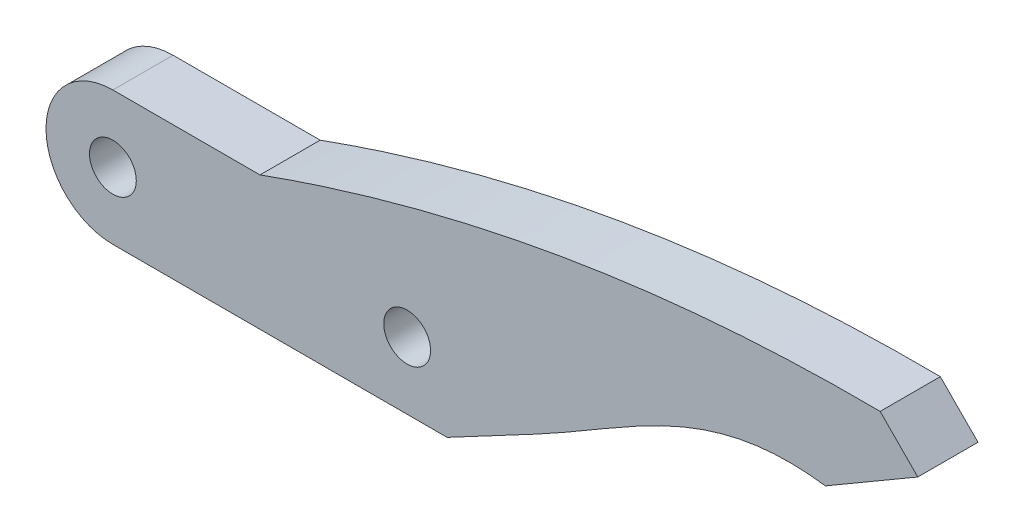
ISO-10303-21;
HEADER;
FILE_DESCRIPTION(('STEP AP214'),'2;1');
FILE_NAME('part.step','',(''),(''),'','','');
FILE_SCHEMA(('AUTOMOTIVE_DESIGN { 1 0 10303 214 1 1 1 1 }'));
ENDSEC;
DATA;
#1=APPLICATION_CONTEXT('core data for automotive mechanical design processes');
#2=APPLICATION_PROTOCOL_DEFINITION('international standard','automotive_design',2000,#1);
#3=PRODUCT_CONTEXT('',#1,'mechanical');
#4=PRODUCT('Part','Part','',(#3));
#5=PRODUCT_RELATED_PRODUCT_CATEGORY('part','',(#4));
#6=PRODUCT_DEFINITION_FORMATION('','',#4);
#7=PRODUCT_DEFINITION_CONTEXT('part definition',#1,'design');
#8=PRODUCT_DEFINITION('design','',#6,#7);
#9=PRODUCT_DEFINITION_SHAPE('','',#8);
#10=(LENGTH_UNIT() NAMED_UNIT(*) SI_UNIT(.MILLI.,.METRE.));
#11=(NAMED_UNIT(*) PLANE_ANGLE_UNIT() SI_UNIT($,.RADIAN.));
#12=(NAMED_UNIT(*) SI_UNIT($,.STERADIAN.) SOLID_ANGLE_UNIT());
#13=UNCERTAINTY_MEASURE_WITH_UNIT(LENGTH_MEASURE(1.E-05),#10,'distance_accuracy_value','');
#14=(GEOMETRIC_REPRESENTATION_CONTEXT(3) GLOBAL_UNCERTAINTY_ASSIGNED_CONTEXT((#13)) GLOBAL_UNIT_ASSIGNED_CONTEXT((#10,
#11,#12)) REPRESENTATION_CONTEXT('',''));
#15=CARTESIAN_POINT('',(0.,0.,0.));
#16=DIRECTION('',(0.,0.,1.));
#17=DIRECTION('',(1.,0.,0.));
#18=AXIS2_PLACEMENT_3D('',#15,#16,#17);
#19=CARTESIAN_POINT('',(-11.,0.,4.5));
#20=DIRECTION('',(0.,0.,-1.));
#21=DIRECTION('',(-1.,0.,0.));
#22=AXIS2_PLACEMENT_3D('',#19,#20,#21);
#23=CYLINDRICAL_SURFACE('',#22,5.);
#24=CARTESIAN_POINT('',(-11.,0.,0.));
#25=DIRECTION('',(0.,0.,1.));
#26=DIRECTION('',(1.,0.,0.));
#27=AXIS2_PLACEMENT_3D('',#24,#25,#26);
#28=CIRCLE('',#27,5.);
#29=CARTESIAN_POINT('',(-11.,5.,0.));
#30=VERTEX_POINT('',#29);
#31=CARTESIAN_POINT('',(-11.,-5.,0.));
#32=VERTEX_POINT('',#31);
#33=EDGE_CURVE('E178',#30,#32,#28,.T.);
#34=ORIENTED_EDGE('',*,*,#33,.T.);
#35=DIRECTION('',(0.,0.,-1.));
#36=VECTOR('',#35,1.);
#37=CARTESIAN_POINT('',(-11.,-5.,4.5));
#38=LINE('',#37,#36);
#39=CARTESIAN_POINT('',(-11.,-5.,4.5));
#40=VERTEX_POINT('',#39);
#41=EDGE_CURVE('E11',#40,#32,#38,.T.);
#42=ORIENTED_EDGE('',*,*,#41,.F.);
#43=CARTESIAN_POINT('',(-11.,0.,4.5));
#44=DIRECTION('',(0.,0.,1.));
#45=DIRECTION('',(1.,0.,0.));
#46=AXIS2_PLACEMENT_3D('',#43,#44,#45);
#47=CIRCLE('',#46,5.);
#48=CARTESIAN_POINT('',(-11.,5.,4.5));
#49=VERTEX_POINT('',#48);
#50=EDGE_CURVE('E158',#49,#40,#47,.T.);
#51=ORIENTED_EDGE('',*,*,#50,.F.);
#52=DIRECTION('',(0.,0.,-1.));
#53=VECTOR('',#52,1.);
#54=CARTESIAN_POINT('',(-11.,5.,4.5));
#55=LINE('',#54,#53);
#56=EDGE_CURVE('E57',#49,#30,#55,.T.);
#57=ORIENTED_EDGE('',*,*,#56,.T.);
#58=EDGE_LOOP('',(#34,#42,#51,#57));
#59=FACE_BOUND('',#58,.T.);
#60=ADVANCED_FACE('F47',(#59),#23,.T.);
#61=CARTESIAN_POINT('',(0.,-5.,4.5));
#62=DIRECTION('',(0.,1.,0.));
#63=DIRECTION('',(0.,0.,1.));
#64=AXIS2_PLACEMENT_3D('',#61,#62,#63);
#65=PLANE('',#64);
#66=DIRECTION('',(1.,0.,0.));
#67=VECTOR('',#66,1.);
#68=CARTESIAN_POINT('',(0.,-5.,0.));
#69=LINE('',#68,#67);
#70=CARTESIAN_POINT('',(13.99,-5.,0.));
#71=VERTEX_POINT('',#70);
#72=EDGE_CURVE('E76',#32,#71,#69,.T.);
#73=ORIENTED_EDGE('',*,*,#72,.T.);
#74=DIRECTION('',(0.,0.,1.));
#75=VECTOR('',#74,1.);
#76=CARTESIAN_POINT('',(13.99,-5.,-52.3687140010499));
#77=LINE('',#76,#75);
#78=CARTESIAN_POINT('',(13.99,-5.,4.5));
#79=VERTEX_POINT('',#78);
#80=EDGE_CURVE('E144',#71,#79,#77,.T.);
#81=ORIENTED_EDGE('',*,*,#80,.T.);
#82=DIRECTION('',(1.,0.,0.));
#83=VECTOR('',#82,1.);
#84=CARTESIAN_POINT('',(0.,-5.,4.5));
#85=LINE('',#84,#83);
#86=EDGE_CURVE('E163',#40,#79,#85,.T.);
#87=ORIENTED_EDGE('',*,*,#86,.F.);
#88=ORIENTED_EDGE('',*,*,#41,.T.);
#89=EDGE_LOOP('',(#73,#81,#87,#88));
#90=FACE_BOUND('',#89,.T.);
#91=ADVANCED_FACE('F276',(#90),#65,.F.);
#92=CARTESIAN_POINT('',(0.,5.,4.5));
#93=DIRECTION('',(0.,1.,0.));
#94=DIRECTION('',(0.,0.,1.));
#95=AXIS2_PLACEMENT_3D('',#92,#93,#94);
#96=PLANE('',#95);
#97=DIRECTION('',(0.,0.,1.));
#98=VECTOR('',#97,1.);
#99=CARTESIAN_POINT('',(0.,5.,-52.3687140010499));
#100=LINE('',#99,#98);
#101=CARTESIAN_POINT('',(0.,5.,0.));
#102=VERTEX_POINT('',#101);
#103=CARTESIAN_POINT('',(0.,5.,4.5));
#104=VERTEX_POINT('',#103);
#105=EDGE_CURVE('E150',#102,#104,#100,.T.);
#106=ORIENTED_EDGE('',*,*,#105,.F.);
#107=DIRECTION('',(1.,0.,0.));
#108=VECTOR('',#107,1.);
#109=CARTESIAN_POINT('',(0.,5.,0.));
#110=LINE('',#109,#108);
#111=EDGE_CURVE('E184',#30,#102,#110,.T.);
#112=ORIENTED_EDGE('',*,*,#111,.F.);
#113=ORIENTED_EDGE('',*,*,#56,.F.);
#114=DIRECTION('',(1.,0.,0.));
#115=VECTOR('',#114,1.);
#116=CARTESIAN_POINT('',(0.,5.,4.5));
#117=LINE('',#116,#115);
#118=EDGE_CURVE('E167',#49,#104,#117,.T.);
#119=ORIENTED_EDGE('',*,*,#118,.T.);
#120=EDGE_LOOP('',(#106,#112,#113,#119));
#121=FACE_BOUND('',#120,.T.);
#122=ADVANCED_FACE('F193',(#121),#96,.T.);
#123=CARTESIAN_POINT('',(-11.,0.,4.5));
#124=DIRECTION('',(0.,0.,-1.));
#125=DIRECTION('',(-1.,0.,0.));
#126=AXIS2_PLACEMENT_3D('',#123,#124,#125);
#127=CYLINDRICAL_SURFACE('',#126,1.75);
#128=CARTESIAN_POINT('',(-11.,0.,4.5));
#129=DIRECTION('',(0.,0.,1.));
#130=DIRECTION('',(1.,0.,0.));
#131=AXIS2_PLACEMENT_3D('',#128,#129,#130);
#132=CIRCLE('',#131,1.75);
#133=CARTESIAN_POINT('',(-9.25,0.,4.5));
#134=VERTEX_POINT('',#133);
#135=EDGE_CURVE('E154',#134,#134,#132,.T.);
#136=ORIENTED_EDGE('',*,*,#135,.T.);
#137=EDGE_LOOP('',(#136));
#138=FACE_BOUND('',#137,.T.);
#139=CARTESIAN_POINT('',(-11.,0.,0.));
#140=DIRECTION('',(0.,0.,1.));
#141=DIRECTION('',(1.,0.,0.));
#142=AXIS2_PLACEMENT_3D('',#139,#140,#141);
#143=CIRCLE('',#142,1.75);
#144=CARTESIAN_POINT('',(-9.25,0.,0.));
#145=VERTEX_POINT('',#144);
#146=EDGE_CURVE('E174',#145,#145,#143,.T.);
#147=ORIENTED_EDGE('',*,*,#146,.F.);
#148=EDGE_LOOP('',(#147));
#149=FACE_BOUND('',#148,.T.);
#150=ADVANCED_FACE('F49',(#138,#149),#127,.F.);
#151=CARTESIAN_POINT('',(11.,0.,4.5));
#152=DIRECTION('',(0.,0.,-1.));
#153=DIRECTION('',(-1.,0.,0.));
#154=AXIS2_PLACEMENT_3D('',#151,#152,#153);
#155=CYLINDRICAL_SURFACE('',#154,1.75);
#156=CARTESIAN_POINT('',(11.,0.,4.5));
#157=DIRECTION('',(0.,0.,1.));
#158=DIRECTION('',(1.,0.,0.));
#159=AXIS2_PLACEMENT_3D('',#156,#157,#158);
#160=CIRCLE('',#159,1.75);
#161=CARTESIAN_POINT('',(12.75,0.,4.5));
#162=VERTEX_POINT('',#161);
#163=EDGE_CURVE('E170',#162,#162,#160,.F.);
#164=ORIENTED_EDGE('',*,*,#163,.F.);
#165=EDGE_LOOP('',(#164));
#166=FACE_BOUND('',#165,.T.);
#167=CARTESIAN_POINT('',(11.,0.,0.));
#168=DIRECTION('',(0.,0.,1.));
#169=DIRECTION('',(1.,0.,0.));
#170=AXIS2_PLACEMENT_3D('',#167,#168,#169);
#171=CIRCLE('',#170,1.75);
#172=CARTESIAN_POINT('',(12.75,0.,0.));
#173=VERTEX_POINT('',#172);
#174=EDGE_CURVE('E159',#173,#173,#171,.F.);
#175=ORIENTED_EDGE('',*,*,#174,.T.);
#176=EDGE_LOOP('',(#175));
#177=FACE_BOUND('',#176,.T.);
#178=ADVANCED_FACE('F268',(#166,#177),#155,.F.);
#179=CARTESIAN_POINT('',(0.,0.,4.5));
#180=DIRECTION('',(0.,0.,1.));
#181=DIRECTION('',(1.,0.,0.));
#182=AXIS2_PLACEMENT_3D('',#179,#180,#181);
#183=PLANE('',#182);
#184=ORIENTED_EDGE('',*,*,#86,.T.);
#185=DIRECTION('',(0.882942972945771,0.469480251475697,0.));
#186=VECTOR('',#185,1.);
#187=CARTESIAN_POINT('',(20.61,-1.48,4.5));
#188=LINE('',#187,#186);
#189=CARTESIAN_POINT('',(20.61,-1.48,4.5));
#190=VERTEX_POINT('',#189);
#191=EDGE_CURVE('E207',#79,#190,#188,.T.);
#192=ORIENTED_EDGE('',*,*,#191,.T.);
#193=CARTESIAN_POINT('',(20.61,-1.48,4.5));
#194=CARTESIAN_POINT('',(27.8015694056562,2.34391605859664,4.5));
#195=CARTESIAN_POINT('',(33.457840426435,7.21367390436092,4.5));
#196=CARTESIAN_POINT('',(42.27,6.,4.5));
#197=B_SPLINE_CURVE_WITH_KNOTS('',3,(#193,#194,#195,#196),.UNSPECIFIED.,.F.,.F.,(4,4),(0.,1.),.UNSPECIFIED.);
#198=CARTESIAN_POINT('',(42.27,6.,4.5));
#199=VERTEX_POINT('',#198);
#200=EDGE_CURVE('E211',#190,#199,#197,.T.);
#201=ORIENTED_EDGE('',*,*,#200,.T.);
#202=DIRECTION('',(0.86384948775814,0.50375,0.));
#203=VECTOR('',#202,1.);
#204=CARTESIAN_POINT('',(49.1807959020651,10.03,4.5));
#205=LINE('',#204,#203);
#206=CARTESIAN_POINT('',(49.1807959020651,10.03,4.5));
#207=VERTEX_POINT('',#206);
#208=EDGE_CURVE('E135',#199,#207,#205,.T.);
#209=ORIENTED_EDGE('',*,*,#208,.T.);
#210=DIRECTION('',(-0.704201675658331,0.709999999999999,0.));
#211=VECTOR('',#210,1.);
#212=CARTESIAN_POINT('',(46.3639891994318,12.87,4.5));
#213=LINE('',#212,#211);
#214=CARTESIAN_POINT('',(46.3639891994318,12.87,4.5));
#215=VERTEX_POINT('',#214);
#216=EDGE_CURVE('E153',#207,#215,#213,.T.);
#217=ORIENTED_EDGE('',*,*,#216,.T.);
#218=CARTESIAN_POINT('',(46.3639891994318,12.87,4.5));
#219=CARTESIAN_POINT('',(22.3874971421725,13.1150813845502,4.5));
#220=CARTESIAN_POINT('',(0.,5.,4.5));
#221=B_SPLINE_CURVE_WITH_KNOTS('',2,(#218,#219,#220),.UNSPECIFIED.,.F.,.F.,(3,3),(0.,1.),.UNSPECIFIED.);
#222=EDGE_CURVE('E198',#215,#104,#221,.T.);
#223=ORIENTED_EDGE('',*,*,#222,.T.);
#224=ORIENTED_EDGE('',*,*,#118,.F.);
#225=ORIENTED_EDGE('',*,*,#50,.T.);
#226=EDGE_LOOP('',(#184,#192,#201,#209,#217,#223,#224,#225));
#227=FACE_BOUND('',#226,.T.);
#228=ORIENTED_EDGE('',*,*,#135,.F.);
#229=EDGE_LOOP('',(#228));
#230=FACE_BOUND('',#229,.T.);
#231=ORIENTED_EDGE('',*,*,#163,.T.);
#232=EDGE_LOOP('',(#231));
#233=FACE_BOUND('',#232,.T.);
#234=ADVANCED_FACE('F203',(#227,#230,#233),#183,.T.);
#235=CARTESIAN_POINT('',(0.,0.,0.));
#236=DIRECTION('',(0.,0.,1.));
#237=DIRECTION('',(1.,0.,0.));
#238=AXIS2_PLACEMENT_3D('',#235,#236,#237);
#239=PLANE('',#238);
#240=DIRECTION('',(-0.882942972945771,-0.469480251475697,0.));
#241=VECTOR('',#240,1.);
#242=CARTESIAN_POINT('',(20.61,-1.48,0.));
#243=LINE('',#242,#241);
#244=CARTESIAN_POINT('',(20.61,-1.48,0.));
#245=VERTEX_POINT('',#244);
#246=EDGE_CURVE('E131',#245,#71,#243,.T.);
#247=ORIENTED_EDGE('',*,*,#246,.T.);
#248=ORIENTED_EDGE('',*,*,#72,.F.);
#249=ORIENTED_EDGE('',*,*,#33,.F.);
#250=ORIENTED_EDGE('',*,*,#111,.T.);
#251=CARTESIAN_POINT('',(46.3639891994318,12.87,0.));
#252=CARTESIAN_POINT('',(22.3874971421725,13.1150813845502,0.));
#253=CARTESIAN_POINT('',(0.,5.,0.));
#254=B_SPLINE_CURVE_WITH_KNOTS('',2,(#251,#252,#253),.UNSPECIFIED.,.F.,.F.,(3,3),(0.,1.),.UNSPECIFIED.);
#255=CARTESIAN_POINT('',(46.3639891994318,12.87,0.));
#256=VERTEX_POINT('',#255);
#257=EDGE_CURVE('E92',#102,#256,#254,.F.);
#258=ORIENTED_EDGE('',*,*,#257,.T.);
#259=DIRECTION('',(0.704201675658331,-0.709999999999999,0.));
#260=VECTOR('',#259,1.);
#261=CARTESIAN_POINT('',(46.3639891994318,12.87,0.));
#262=LINE('',#261,#260);
#263=CARTESIAN_POINT('',(49.1807959020651,10.03,0.));
#264=VERTEX_POINT('',#263);
#265=EDGE_CURVE('E113',#256,#264,#262,.T.);
#266=ORIENTED_EDGE('',*,*,#265,.T.);
#267=DIRECTION('',(-0.863849487758139,-0.50375,0.));
#268=VECTOR('',#267,1.);
#269=CARTESIAN_POINT('',(49.1807959020651,10.03,0.));
#270=LINE('',#269,#268);
#271=CARTESIAN_POINT('',(42.27,6.,0.));
#272=VERTEX_POINT('',#271);
#273=EDGE_CURVE('E107',#264,#272,#270,.T.);
#274=ORIENTED_EDGE('',*,*,#273,.T.);
#275=CARTESIAN_POINT('',(20.61,-1.48,0.));
#276=CARTESIAN_POINT('',(27.8015694056562,2.34391605859664,0.));
#277=CARTESIAN_POINT('',(33.457840426435,7.21367390436092,0.));
#278=CARTESIAN_POINT('',(42.27,6.,0.));
#279=B_SPLINE_CURVE_WITH_KNOTS('',3,(#275,#276,#277,#278),.UNSPECIFIED.,.F.,.F.,(4,4),(0.,1.),.UNSPECIFIED.);
#280=EDGE_CURVE('E111',#272,#245,#279,.F.);
#281=ORIENTED_EDGE('',*,*,#280,.T.);
#282=EDGE_LOOP('',(#247,#248,#249,#250,#258,#266,#274,#281));
#283=FACE_BOUND('',#282,.T.);
#284=ORIENTED_EDGE('',*,*,#146,.T.);
#285=EDGE_LOOP('',(#284));
#286=FACE_BOUND('',#285,.T.);
#287=ORIENTED_EDGE('',*,*,#174,.F.);
#288=EDGE_LOOP('',(#287));
#289=FACE_BOUND('',#288,.T.);
#290=ADVANCED_FACE('F109',(#283,#286,#289),#239,.F.);
#291=CARTESIAN_POINT('',(46.3639891994318,12.87,-52.3687140010499));
#292=CARTESIAN_POINT('',(22.3874971421725,13.1150813845502,-52.3687140010499));
#293=CARTESIAN_POINT('',(0.,5.,-52.3687140010499));
#294=B_SPLINE_CURVE_WITH_KNOTS('',2,(#291,#292,#293),.UNSPECIFIED.,.F.,.F.,(3,3),(0.,1.),.UNSPECIFIED.);
#295=DIRECTION('',(0.,0.,1.));
#296=VECTOR('',#295,1.);
#297=SURFACE_OF_LINEAR_EXTRUSION('',#294,#296);
#298=ORIENTED_EDGE('',*,*,#257,.F.);
#299=ORIENTED_EDGE('',*,*,#105,.T.);
#300=ORIENTED_EDGE('',*,*,#222,.F.);
#301=DIRECTION('',(0.,0.,1.));
#302=VECTOR('',#301,1.);
#303=CARTESIAN_POINT('',(46.3639891994318,12.87,-52.3687140010499));
#304=LINE('',#303,#302);
#305=EDGE_CURVE('E142',#256,#215,#304,.T.);
#306=ORIENTED_EDGE('',*,*,#305,.F.);
#307=EDGE_LOOP('',(#298,#299,#300,#306));
#308=FACE_BOUND('',#307,.T.);
#309=ADVANCED_FACE('F197',(#308),#297,.T.);
#310=CARTESIAN_POINT('',(46.3639891994318,12.87,-52.3687140010499));
#311=DIRECTION('',(0.709999999999999,0.704201675658331,0.));
#312=DIRECTION('',(-0.704201675658331,0.709999999999999,0.));
#313=AXIS2_PLACEMENT_3D('',#310,#311,#312);
#314=PLANE('',#313);
#315=ORIENTED_EDGE('',*,*,#265,.F.);
#316=ORIENTED_EDGE('',*,*,#305,.T.);
#317=ORIENTED_EDGE('',*,*,#216,.F.);
#318=DIRECTION('',(0.,0.,1.));
#319=VECTOR('',#318,1.);
#320=CARTESIAN_POINT('',(49.1807959020651,10.03,-52.3687140010499));
#321=LINE('',#320,#319);
#322=EDGE_CURVE('E138',#264,#207,#321,.T.);
#323=ORIENTED_EDGE('',*,*,#322,.F.);
#324=EDGE_LOOP('',(#315,#316,#317,#323));
#325=FACE_BOUND('',#324,.T.);
#326=ADVANCED_FACE('F263',(#325),#314,.T.);
#327=CARTESIAN_POINT('',(49.1807959020651,10.03,-52.3687140010499));
#328=DIRECTION('',(0.50375,-0.863849487758139,0.));
#329=DIRECTION('',(0.863849487758139,0.50375,0.));
#330=AXIS2_PLACEMENT_3D('',#327,#328,#329);
#331=PLANE('',#330);
#332=ORIENTED_EDGE('',*,*,#273,.F.);
#333=ORIENTED_EDGE('',*,*,#322,.T.);
#334=ORIENTED_EDGE('',*,*,#208,.F.);
#335=DIRECTION('',(0.,0.,1.));
#336=VECTOR('',#335,1.);
#337=CARTESIAN_POINT('',(42.27,6.,-52.3687140010499));
#338=LINE('',#337,#336);
#339=EDGE_CURVE('E126',#272,#199,#338,.T.);
#340=ORIENTED_EDGE('',*,*,#339,.F.);
#341=EDGE_LOOP('',(#332,#333,#334,#340));
#342=FACE_BOUND('',#341,.T.);
#343=ADVANCED_FACE('F133',(#342),#331,.T.);
#344=CARTESIAN_POINT('',(20.61,-1.48,-52.3687140010499));
#345=CARTESIAN_POINT('',(27.8015694056562,2.34391605859664,-52.3687140010499));
#346=CARTESIAN_POINT('',(33.457840426435,7.21367390436092,-52.3687140010499));
#347=CARTESIAN_POINT('',(42.27,6.,-52.3687140010499));
#348=B_SPLINE_CURVE_WITH_KNOTS('',3,(#344,#345,#346,#347),.UNSPECIFIED.,.F.,.F.,(4,4),(0.,1.),.UNSPECIFIED.);
#349=DIRECTION('',(0.,0.,1.));
#350=VECTOR('',#349,1.);
#351=SURFACE_OF_LINEAR_EXTRUSION('',#348,#350);
#352=ORIENTED_EDGE('',*,*,#280,.F.);
#353=ORIENTED_EDGE('',*,*,#339,.T.);
#354=ORIENTED_EDGE('',*,*,#200,.F.);
#355=DIRECTION('',(0.,0.,1.));
#356=VECTOR('',#355,1.);
#357=CARTESIAN_POINT('',(20.61,-1.48,-52.3687140010499));
#358=LINE('',#357,#356);
#359=EDGE_CURVE('E129',#245,#190,#358,.T.);
#360=ORIENTED_EDGE('',*,*,#359,.F.);
#361=EDGE_LOOP('',(#352,#353,#354,#360));
#362=FACE_BOUND('',#361,.T.);
#363=ADVANCED_FACE('F123',(#362),#351,.T.);
#364=CARTESIAN_POINT('',(20.61,-1.48,-52.3687140010499));
#365=DIRECTION('',(0.469480251475697,-0.882942972945771,0.));
#366=DIRECTION('',(0.882942972945771,0.469480251475697,0.));
#367=AXIS2_PLACEMENT_3D('',#364,#365,#366);
#368=PLANE('',#367);
#369=ORIENTED_EDGE('',*,*,#246,.F.);
#370=ORIENTED_EDGE('',*,*,#359,.T.);
#371=ORIENTED_EDGE('',*,*,#191,.F.);
#372=ORIENTED_EDGE('',*,*,#80,.F.);
#373=EDGE_LOOP('',(#369,#370,#371,#372));
#374=FACE_BOUND('',#373,.T.);
#375=ADVANCED_FACE('F264',(#374),#368,.T.);
#376=CLOSED_SHELL('',(#60,#91,#122,#150,#178,#234,#290,#309,#326,#343,#363,#375));
#377=MANIFOLD_SOLID_BREP('B2',#376);
#378=ADVANCED_BREP_SHAPE_REPRESENTATION('',(#18,#377),#14);
#379=SHAPE_DEFINITION_REPRESENTATION(#9,#378);
ENDSEC;
END-ISO-10303-21;
